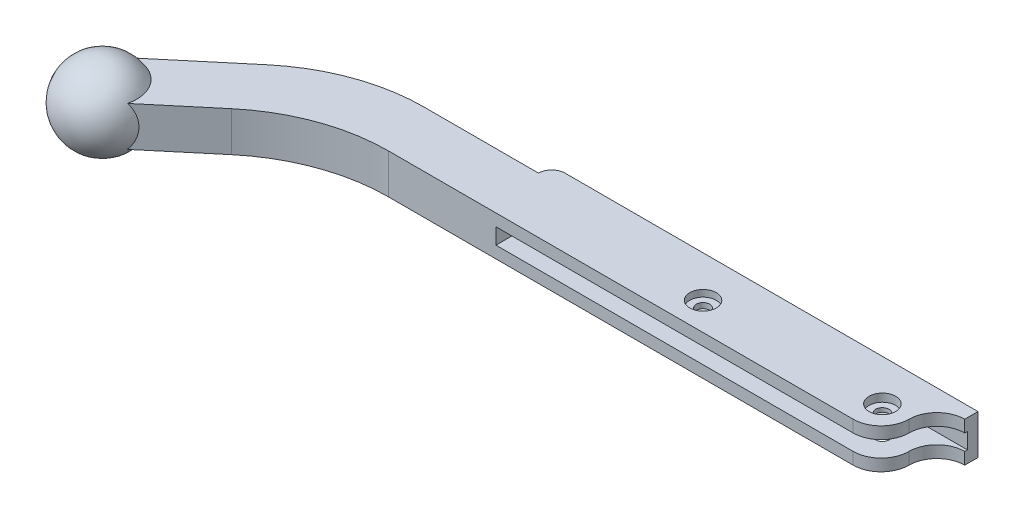
ISO-10303-21;
HEADER;
FILE_DESCRIPTION(('STEP AP214'),'2;1');
FILE_NAME('part.step','',(''),(''),'','','');
FILE_SCHEMA(('AUTOMOTIVE_DESIGN { 1 0 10303 214 1 1 1 1 }'));
ENDSEC;
DATA;
#1=APPLICATION_CONTEXT('core data for automotive mechanical design processes');
#2=APPLICATION_PROTOCOL_DEFINITION('international standard','automotive_design',2000,#1);
#3=PRODUCT_CONTEXT('',#1,'mechanical');
#4=PRODUCT('Part','Part','',(#3));
#5=PRODUCT_RELATED_PRODUCT_CATEGORY('part','',(#4));
#6=PRODUCT_DEFINITION_FORMATION('','',#4);
#7=PRODUCT_DEFINITION_CONTEXT('part definition',#1,'design');
#8=PRODUCT_DEFINITION('design','',#6,#7);
#9=PRODUCT_DEFINITION_SHAPE('','',#8);
#10=(LENGTH_UNIT() NAMED_UNIT(*) SI_UNIT(.MILLI.,.METRE.));
#11=(NAMED_UNIT(*) PLANE_ANGLE_UNIT() SI_UNIT($,.RADIAN.));
#12=(NAMED_UNIT(*) SI_UNIT($,.STERADIAN.) SOLID_ANGLE_UNIT());
#13=UNCERTAINTY_MEASURE_WITH_UNIT(LENGTH_MEASURE(1.E-05),#10,'distance_accuracy_value','');
#14=(GEOMETRIC_REPRESENTATION_CONTEXT(3) GLOBAL_UNCERTAINTY_ASSIGNED_CONTEXT((#13)) GLOBAL_UNIT_ASSIGNED_CONTEXT((#10,
#11,#12)) REPRESENTATION_CONTEXT('',''));
#15=CARTESIAN_POINT('',(0.,0.,0.));
#16=DIRECTION('',(0.,0.,1.));
#17=DIRECTION('',(1.,0.,0.));
#18=AXIS2_PLACEMENT_3D('',#15,#16,#17);
#19=CARTESIAN_POINT('',(52.9707846410685,15.,-18.1552587646077));
#20=DIRECTION('',(-1.,0.,0.));
#21=DIRECTION('',(0.,0.,1.));
#22=AXIS2_PLACEMENT_3D('',#19,#20,#21);
#23=PLANE('',#22);
#24=DIRECTION('',(0.,0.,-1.));
#25=VECTOR('',#24,1.);
#26=CARTESIAN_POINT('',(52.9707846410685,4.5,-18.1552587646077));
#27=LINE('',#26,#25);
#28=CARTESIAN_POINT('',(52.9707846410685,4.5,-13.1552587646077));
#29=VERTEX_POINT('',#28);
#30=CARTESIAN_POINT('',(52.9707846410685,4.5,-14.1552587646077));
#31=VERTEX_POINT('',#30);
#32=EDGE_CURVE('E180',#29,#31,#27,.T.);
#33=ORIENTED_EDGE('',*,*,#32,.F.);
#34=DIRECTION('',(0.,-1.,0.));
#35=VECTOR('',#34,1.);
#36=CARTESIAN_POINT('',(52.9707846410685,15.,-13.1552587646077));
#37=LINE('',#36,#35);
#38=CARTESIAN_POINT('',(52.9707846410685,0.,-13.1552587646077));
#39=VERTEX_POINT('',#38);
#40=EDGE_CURVE('E225',#29,#39,#37,.T.);
#41=ORIENTED_EDGE('',*,*,#40,.T.);
#42=DIRECTION('',(0.,0.,1.));
#43=VECTOR('',#42,1.);
#44=CARTESIAN_POINT('',(52.9707846410685,0.,-18.1552587646077));
#45=LINE('',#44,#43);
#46=CARTESIAN_POINT('',(52.9707846410685,0.,-18.1552587646077));
#47=VERTEX_POINT('',#46);
#48=EDGE_CURVE('E234',#47,#39,#45,.T.);
#49=ORIENTED_EDGE('',*,*,#48,.F.);
#50=DIRECTION('',(0.,-1.,0.));
#51=VECTOR('',#50,1.);
#52=CARTESIAN_POINT('',(52.9707846410685,15.,-18.1552587646077));
#53=LINE('',#52,#51);
#54=CARTESIAN_POINT('',(52.9707846410685,15.,-18.1552587646077));
#55=VERTEX_POINT('',#54);
#56=EDGE_CURVE('E228',#55,#47,#53,.T.);
#57=ORIENTED_EDGE('',*,*,#56,.F.);
#58=DIRECTION('',(0.,0.,1.));
#59=VECTOR('',#58,1.);
#60=CARTESIAN_POINT('',(52.9707846410685,15.,-18.1552587646077));
#61=LINE('',#60,#59);
#62=CARTESIAN_POINT('',(52.9707846410685,15.,-13.1552587646077));
#63=VERTEX_POINT('',#62);
#64=EDGE_CURVE('E239',#55,#63,#61,.T.);
#65=ORIENTED_EDGE('',*,*,#64,.T.);
#66=CARTESIAN_POINT('',(52.9707846410685,10.5,-13.1552587646077));
#67=VERTEX_POINT('',#66);
#68=EDGE_CURVE('E229',#63,#67,#37,.T.);
#69=ORIENTED_EDGE('',*,*,#68,.T.);
#70=DIRECTION('',(0.,0.,1.));
#71=VECTOR('',#70,1.);
#72=CARTESIAN_POINT('',(52.9707846410685,10.5,-18.1552587646077));
#73=LINE('',#72,#71);
#74=CARTESIAN_POINT('',(52.9707846410685,10.5,-14.1552587646077));
#75=VERTEX_POINT('',#74);
#76=EDGE_CURVE('E183',#75,#67,#73,.T.);
#77=ORIENTED_EDGE('',*,*,#76,.F.);
#78=DIRECTION('',(0.,1.,0.));
#79=VECTOR('',#78,1.);
#80=CARTESIAN_POINT('',(52.9707846410685,15.,-14.1552587646077));
#81=LINE('',#80,#79);
#82=EDGE_CURVE('E11',#31,#75,#81,.T.);
#83=ORIENTED_EDGE('',*,*,#82,.F.);
#84=EDGE_LOOP('',(#33,#41,#49,#57,#65,#69,#77,#83));
#85=FACE_BOUND('',#84,.T.);
#86=ADVANCED_FACE('F39',(#85),#23,.F.);
#87=CARTESIAN_POINT('',(-35.0662422389316,-5.,-2.65525876460767));
#88=DIRECTION('',(0.,1.,0.));
#89=DIRECTION('',(0.,0.,1.));
#90=AXIS2_PLACEMENT_3D('',#87,#88,#89);
#91=CYLINDRICAL_SURFACE('',#90,5.);
#92=CARTESIAN_POINT('',(-35.0662422389316,15.,-2.65525876460767));
#93=DIRECTION('',(0.,1.,0.));
#94=DIRECTION('',(0.,0.,1.));
#95=AXIS2_PLACEMENT_3D('',#92,#93,#94);
#96=CIRCLE('',#95,5.);
#97=CARTESIAN_POINT('',(-35.0662422389316,15.,2.34474123539233));
#98=VERTEX_POINT('',#97);
#99=EDGE_CURVE('E252',#98,#98,#96,.T.);
#100=ORIENTED_EDGE('',*,*,#99,.T.);
#101=EDGE_LOOP('',(#100));
#102=FACE_BOUND('',#101,.T.);
#103=CARTESIAN_POINT('',(-35.0662422389316,12.5,-2.65525876460767));
#104=DIRECTION('',(0.,-1.,0.));
#105=DIRECTION('',(0.,0.,-1.));
#106=AXIS2_PLACEMENT_3D('',#103,#104,#105);
#107=CIRCLE('',#106,5.);
#108=CARTESIAN_POINT('',(-35.0662422389316,12.5,-7.65525876460768));
#109=VERTEX_POINT('',#108);
#110=EDGE_CURVE('E296',#109,#109,#107,.F.);
#111=ORIENTED_EDGE('',*,*,#110,.F.);
#112=EDGE_LOOP('',(#111));
#113=FACE_BOUND('',#112,.T.);
#114=ADVANCED_FACE('F404',(#102,#113),#91,.F.);
#115=CARTESIAN_POINT('',(-35.0662422389316,0.,-2.65525876460767));
#116=DIRECTION('',(0.,1.,0.));
#117=DIRECTION('',(0.,0.,1.));
#118=AXIS2_PLACEMENT_3D('',#115,#116,#117);
#119=CIRCLE('',#118,5.);
#120=CARTESIAN_POINT('',(-35.0662422389316,0.,2.34474123539233));
#121=VERTEX_POINT('',#120);
#122=EDGE_CURVE('E255',#121,#121,#119,.T.);
#123=ORIENTED_EDGE('',*,*,#122,.F.);
#124=EDGE_LOOP('',(#123));
#125=FACE_BOUND('',#124,.T.);
#126=CARTESIAN_POINT('',(-35.0662422389316,2.5,-2.65525876460767));
#127=DIRECTION('',(0.,1.,0.));
#128=DIRECTION('',(0.,0.,1.));
#129=AXIS2_PLACEMENT_3D('',#126,#127,#128);
#130=CIRCLE('',#129,5.);
#131=CARTESIAN_POINT('',(-35.0662422389316,2.5,2.34474123539233));
#132=VERTEX_POINT('',#131);
#133=EDGE_CURVE('E290',#132,#132,#130,.F.);
#134=ORIENTED_EDGE('',*,*,#133,.F.);
#135=EDGE_LOOP('',(#134));
#136=FACE_BOUND('',#135,.T.);
#137=ADVANCED_FACE('F410',(#125,#136),#91,.F.);
#138=CARTESIAN_POINT('',(-107.529215358932,15.,7.84474123539233));
#139=DIRECTION('',(0.,0.,-1.));
#140=DIRECTION('',(-1.,0.,0.));
#141=AXIS2_PLACEMENT_3D('',#138,#139,#140);
#142=PLANE('',#141);
#143=DIRECTION('',(1.,0.,0.));
#144=VECTOR('',#143,1.);
#145=CARTESIAN_POINT('',(-107.529215358932,15.,7.84474123539233));
#146=LINE('',#145,#144);
#147=CARTESIAN_POINT('',(-142.961224545963,15.,7.84474123539233));
#148=VERTEX_POINT('',#147);
#149=CARTESIAN_POINT('',(31.9707846410685,15.,7.84474123539233));
#150=VERTEX_POINT('',#149);
#151=EDGE_CURVE('E288',#148,#150,#146,.T.);
#152=ORIENTED_EDGE('',*,*,#151,.F.);
#153=DIRECTION('',(0.,1.,0.));
#154=VECTOR('',#153,1.);
#155=CARTESIAN_POINT('',(-142.961224545963,15.,7.84474123539233));
#156=LINE('',#155,#154);
#157=CARTESIAN_POINT('',(-142.961224545963,0.,7.84474123539233));
#158=VERTEX_POINT('',#157);
#159=EDGE_CURVE('E338',#148,#158,#156,.F.);
#160=ORIENTED_EDGE('',*,*,#159,.T.);
#161=DIRECTION('',(1.,0.,0.));
#162=VECTOR('',#161,1.);
#163=CARTESIAN_POINT('',(-107.529215358932,0.,7.84474123539233));
#164=LINE('',#163,#162);
#165=CARTESIAN_POINT('',(31.9707846410685,0.,7.84474123539233));
#166=VERTEX_POINT('',#165);
#167=EDGE_CURVE('E286',#158,#166,#164,.T.);
#168=ORIENTED_EDGE('',*,*,#167,.T.);
#169=DIRECTION('',(0.,-1.,0.));
#170=VECTOR('',#169,1.);
#171=CARTESIAN_POINT('',(31.9707846410685,15.,7.84474123539233));
#172=LINE('',#171,#170);
#173=CARTESIAN_POINT('',(31.9707846410685,4.5,7.84474123539233));
#174=VERTEX_POINT('',#173);
#175=EDGE_CURVE('E314',#166,#174,#172,.F.);
#176=ORIENTED_EDGE('',*,*,#175,.T.);
#177=DIRECTION('',(1.,0.,0.));
#178=VECTOR('',#177,1.);
#179=CARTESIAN_POINT('',(-102.529215358932,4.5,7.84474123539233));
#180=LINE('',#179,#178);
#181=CARTESIAN_POINT('',(-102.529215358932,4.5,7.84474123539233));
#182=VERTEX_POINT('',#181);
#183=EDGE_CURVE('E282',#182,#174,#180,.T.);
#184=ORIENTED_EDGE('',*,*,#183,.F.);
#185=DIRECTION('',(0.,-1.,0.));
#186=VECTOR('',#185,1.);
#187=CARTESIAN_POINT('',(-102.529215358932,10.5,7.84474123539233));
#188=LINE('',#187,#186);
#189=CARTESIAN_POINT('',(-102.529215358932,10.5,7.84474123539233));
#190=VERTEX_POINT('',#189);
#191=EDGE_CURVE('E170',#190,#182,#188,.T.);
#192=ORIENTED_EDGE('',*,*,#191,.F.);
#193=DIRECTION('',(1.,0.,0.));
#194=VECTOR('',#193,1.);
#195=CARTESIAN_POINT('',(-102.529215358932,10.5,7.84474123539233));
#196=LINE('',#195,#194);
#197=CARTESIAN_POINT('',(31.9707846410685,10.5,7.84474123539233));
#198=VERTEX_POINT('',#197);
#199=EDGE_CURVE('E283',#190,#198,#196,.T.);
#200=ORIENTED_EDGE('',*,*,#199,.T.);
#201=DIRECTION('',(0.,-1.,0.));
#202=VECTOR('',#201,1.);
#203=CARTESIAN_POINT('',(31.9707846410685,15.,7.84474123539233));
#204=LINE('',#203,#202);
#205=EDGE_CURVE('E311',#198,#150,#204,.F.);
#206=ORIENTED_EDGE('',*,*,#205,.T.);
#207=EDGE_LOOP('',(#152,#160,#168,#176,#184,#192,#200,#206));
#208=FACE_BOUND('',#207,.T.);
#209=ADVANCED_FACE('F366',(#208),#142,.F.);
#210=CARTESIAN_POINT('',(0.,15.,0.));
#211=DIRECTION('',(0.,1.,0.));
#212=DIRECTION('',(0.,0.,1.));
#213=AXIS2_PLACEMENT_3D('',#210,#211,#212);
#214=PLANE('',#213);
#215=ORIENTED_EDGE('',*,*,#99,.F.);
#216=EDGE_LOOP('',(#215));
#217=FACE_BOUND('',#216,.T.);
#218=CARTESIAN_POINT('',(32.4707846410684,15.,-2.65525876460767));
#219=DIRECTION('',(0.,1.,0.));
#220=DIRECTION('',(0.,0.,1.));
#221=AXIS2_PLACEMENT_3D('',#218,#219,#220);
#222=CIRCLE('',#221,5.);
#223=CARTESIAN_POINT('',(32.4707846410684,15.,2.34474123539233));
#224=VERTEX_POINT('',#223);
#225=EDGE_CURVE('E272',#224,#224,#222,.T.);
#226=ORIENTED_EDGE('',*,*,#225,.F.);
#227=EDGE_LOOP('',(#226));
#228=FACE_BOUND('',#227,.T.);
#229=DIRECTION('',(-1.,0.,0.));
#230=VECTOR('',#229,1.);
#231=CARTESIAN_POINT('',(-107.529215358932,15.,-13.1552587646077));
#232=LINE('',#231,#230);
#233=CARTESIAN_POINT('',(-107.529215358932,15.,-13.1552587646077));
#234=VERTEX_POINT('',#233);
#235=CARTESIAN_POINT('',(-150.604599465553,15.,-13.1552587646077));
#236=VERTEX_POINT('',#235);
#237=EDGE_CURVE('E204',#234,#236,#232,.T.);
#238=ORIENTED_EDGE('',*,*,#237,.T.);
#239=CARTESIAN_POINT('',(-150.604599465553,15.,54.3447412353923));
#240=DIRECTION('',(0.,1.,0.));
#241=DIRECTION('',(0.,0.,1.));
#242=AXIS2_PLACEMENT_3D('',#239,#240,#241);
#243=CIRCLE('',#242,67.5);
#244=CARTESIAN_POINT('',(-193.992763119394,15.,2.63674132486123));
#245=VERTEX_POINT('',#244);
#246=EDGE_CURVE('E62',#236,#245,#243,.T.);
#247=ORIENTED_EDGE('',*,*,#246,.T.);
#248=DIRECTION('',(-0.766044443118979,0.,0.642787609686538));
#249=VECTOR('',#248,1.);
#250=CARTESIAN_POINT('',(-226.990421749487,15.,30.3250645110862));
#251=LINE('',#250,#249);
#252=CARTESIAN_POINT('',(-221.131308403873,15.,25.4086846637552));
#253=VERTEX_POINT('',#252);
#254=EDGE_CURVE('E216',#245,#253,#251,.T.);
#255=ORIENTED_EDGE('',*,*,#254,.T.);
#256=CARTESIAN_POINT('',(-220.241151847779,15.,38.3685311638355));
#257=DIRECTION('',(0.,-1.,0.));
#258=DIRECTION('',(0.,0.,-1.));
#259=AXIS2_PLACEMENT_3D('',#256,#257,#258);
#260=CIRCLE('',#259,12.9903810567666);
#261=CARTESIAN_POINT('',(-207.632768600456,15.,41.4956179692538));
#262=VERTEX_POINT('',#261);
#263=EDGE_CURVE('E222',#262,#253,#260,.F.);
#264=ORIENTED_EDGE('',*,*,#263,.F.);
#265=DIRECTION('',(0.766044443118977,0.,-0.64278760968654));
#266=VECTOR('',#265,1.);
#267=CARTESIAN_POINT('',(-167.529215358932,15.,7.84474123539233));
#268=LINE('',#267,#266);
#269=CARTESIAN_POINT('',(-186.349388199804,15.,23.6367413248614));
#270=VERTEX_POINT('',#269);
#271=EDGE_CURVE('E209',#262,#270,#268,.T.);
#272=ORIENTED_EDGE('',*,*,#271,.T.);
#273=CARTESIAN_POINT('',(-142.961224545963,15.,75.3447412353923));
#274=DIRECTION('',(0.,1.,0.));
#275=DIRECTION('',(0.,0.,1.));
#276=AXIS2_PLACEMENT_3D('',#273,#274,#275);
#277=CIRCLE('',#276,67.5);
#278=EDGE_CURVE('E347',#270,#148,#277,.F.);
#279=ORIENTED_EDGE('',*,*,#278,.T.);
#280=ORIENTED_EDGE('',*,*,#151,.T.);
#281=CARTESIAN_POINT('',(31.9707846410685,15.,-2.65525876460767));
#282=DIRECTION('',(0.,1.,0.));
#283=DIRECTION('',(0.,0.,1.));
#284=AXIS2_PLACEMENT_3D('',#281,#282,#283);
#285=CIRCLE('',#284,10.5);
#286=CARTESIAN_POINT('',(42.4707846410685,15.,-2.65525876460768));
#287=VERTEX_POINT('',#286);
#288=EDGE_CURVE('E321',#150,#287,#285,.T.);
#289=ORIENTED_EDGE('',*,*,#288,.T.);
#290=CARTESIAN_POINT('',(52.9707846410685,15.,-2.65525876460767));
#291=DIRECTION('',(0.,1.,0.));
#292=DIRECTION('',(0.,0.,1.));
#293=AXIS2_PLACEMENT_3D('',#290,#291,#292);
#294=CIRCLE('',#293,10.5);
#295=EDGE_CURVE('E329',#287,#63,#294,.F.);
#296=ORIENTED_EDGE('',*,*,#295,.T.);
#297=ORIENTED_EDGE('',*,*,#64,.F.);
#298=DIRECTION('',(1.,0.,0.));
#299=VECTOR('',#298,1.);
#300=CARTESIAN_POINT('',(-107.529215358932,15.,-18.1552587646077));
#301=LINE('',#300,#299);
#302=CARTESIAN_POINT('',(-102.529215358932,15.,-18.1552587646077));
#303=VERTEX_POINT('',#302);
#304=EDGE_CURVE('E226',#303,#55,#301,.T.);
#305=ORIENTED_EDGE('',*,*,#304,.F.);
#306=CARTESIAN_POINT('',(-102.529215358932,15.,-13.1552587646077));
#307=DIRECTION('',(0.,1.,0.));
#308=DIRECTION('',(0.,0.,1.));
#309=AXIS2_PLACEMENT_3D('',#306,#307,#308);
#310=CIRCLE('',#309,5.);
#311=EDGE_CURVE('E304',#303,#234,#310,.T.);
#312=ORIENTED_EDGE('',*,*,#311,.T.);
#313=EDGE_LOOP('',(#238,#247,#255,#264,#272,#279,#280,#289,#296,#297,#305,#312));
#314=FACE_BOUND('',#313,.T.);
#315=ADVANCED_FACE('F363',(#217,#228,#314),#214,.T.);
#316=CARTESIAN_POINT('',(0.,0.,0.));
#317=DIRECTION('',(0.,1.,0.));
#318=DIRECTION('',(0.,0.,1.));
#319=AXIS2_PLACEMENT_3D('',#316,#317,#318);
#320=PLANE('',#319);
#321=ORIENTED_EDGE('',*,*,#122,.T.);
#322=EDGE_LOOP('',(#321));
#323=FACE_BOUND('',#322,.T.);
#324=CARTESIAN_POINT('',(32.4707846410684,0.,-2.65525876460767));
#325=DIRECTION('',(0.,-1.,0.));
#326=DIRECTION('',(0.,0.,-1.));
#327=AXIS2_PLACEMENT_3D('',#324,#325,#326);
#328=CIRCLE('',#327,5.);
#329=CARTESIAN_POINT('',(32.4707846410684,0.,-7.65525876460768));
#330=VERTEX_POINT('',#329);
#331=EDGE_CURVE('E268',#330,#330,#328,.T.);
#332=ORIENTED_EDGE('',*,*,#331,.F.);
#333=EDGE_LOOP('',(#332));
#334=FACE_BOUND('',#333,.T.);
#335=DIRECTION('',(-0.766044443118979,0.,0.642787609686538));
#336=VECTOR('',#335,1.);
#337=CARTESIAN_POINT('',(-226.990421749487,0.,30.3250645110862));
#338=LINE('',#337,#336);
#339=CARTESIAN_POINT('',(-193.992763119394,0.,2.63674132486123));
#340=VERTEX_POINT('',#339);
#341=CARTESIAN_POINT('',(-221.131308403873,0.,25.4086846637552));
#342=VERTEX_POINT('',#341);
#343=EDGE_CURVE('E208',#340,#342,#338,.T.);
#344=ORIENTED_EDGE('',*,*,#343,.F.);
#345=CARTESIAN_POINT('',(-150.604599465553,0.,54.3447412353923));
#346=DIRECTION('',(0.,1.,0.));
#347=DIRECTION('',(0.,0.,1.));
#348=AXIS2_PLACEMENT_3D('',#345,#346,#347);
#349=CIRCLE('',#348,67.5);
#350=CARTESIAN_POINT('',(-150.604599465553,0.,-13.1552587646077));
#351=VERTEX_POINT('',#350);
#352=EDGE_CURVE('E345',#340,#351,#349,.F.);
#353=ORIENTED_EDGE('',*,*,#352,.T.);
#354=DIRECTION('',(-1.,0.,0.));
#355=VECTOR('',#354,1.);
#356=CARTESIAN_POINT('',(-107.529215358932,0.,-13.1552587646077));
#357=LINE('',#356,#355);
#358=CARTESIAN_POINT('',(-107.529215358932,0.,-13.1552587646077));
#359=VERTEX_POINT('',#358);
#360=EDGE_CURVE('E205',#359,#351,#357,.T.);
#361=ORIENTED_EDGE('',*,*,#360,.F.);
#362=CARTESIAN_POINT('',(-102.529215358932,0.,-13.1552587646077));
#363=DIRECTION('',(0.,1.,0.));
#364=DIRECTION('',(0.,0.,1.));
#365=AXIS2_PLACEMENT_3D('',#362,#363,#364);
#366=CIRCLE('',#365,5.);
#367=CARTESIAN_POINT('',(-102.529215358932,0.,-18.1552587646077));
#368=VERTEX_POINT('',#367);
#369=EDGE_CURVE('E306',#359,#368,#366,.F.);
#370=ORIENTED_EDGE('',*,*,#369,.T.);
#371=DIRECTION('',(-1.,0.,0.));
#372=VECTOR('',#371,1.);
#373=CARTESIAN_POINT('',(-107.529215358932,0.,-18.1552587646077));
#374=LINE('',#373,#372);
#375=EDGE_CURVE('E231',#47,#368,#374,.T.);
#376=ORIENTED_EDGE('',*,*,#375,.F.);
#377=ORIENTED_EDGE('',*,*,#48,.T.);
#378=CARTESIAN_POINT('',(52.9707846410685,0.,-2.65525876460767));
#379=DIRECTION('',(0.,1.,0.));
#380=DIRECTION('',(0.,0.,1.));
#381=AXIS2_PLACEMENT_3D('',#378,#379,#380);
#382=CIRCLE('',#381,10.5);
#383=CARTESIAN_POINT('',(42.4707846410685,0.,-2.65525876460768));
#384=VERTEX_POINT('',#383);
#385=EDGE_CURVE('E323',#39,#384,#382,.T.);
#386=ORIENTED_EDGE('',*,*,#385,.T.);
#387=CARTESIAN_POINT('',(31.9707846410685,0.,-2.65525876460767));
#388=DIRECTION('',(0.,1.,0.));
#389=DIRECTION('',(0.,0.,1.));
#390=AXIS2_PLACEMENT_3D('',#387,#388,#389);
#391=CIRCLE('',#390,10.5);
#392=EDGE_CURVE('E308',#384,#166,#391,.F.);
#393=ORIENTED_EDGE('',*,*,#392,.T.);
#394=ORIENTED_EDGE('',*,*,#167,.F.);
#395=CARTESIAN_POINT('',(-142.961224545963,0.,75.3447412353923));
#396=DIRECTION('',(0.,1.,0.));
#397=DIRECTION('',(0.,0.,1.));
#398=AXIS2_PLACEMENT_3D('',#395,#396,#397);
#399=CIRCLE('',#398,67.5);
#400=CARTESIAN_POINT('',(-186.349388199804,0.,23.6367413248614));
#401=VERTEX_POINT('',#400);
#402=EDGE_CURVE('E47',#158,#401,#399,.T.);
#403=ORIENTED_EDGE('',*,*,#402,.T.);
#404=DIRECTION('',(0.766044443118977,0.,-0.64278760968654));
#405=VECTOR('',#404,1.);
#406=CARTESIAN_POINT('',(-167.529215358932,0.,7.84474123539233));
#407=LINE('',#406,#405);
#408=CARTESIAN_POINT('',(-207.632768600456,0.,41.4956179692538));
#409=VERTEX_POINT('',#408);
#410=EDGE_CURVE('E211',#409,#401,#407,.T.);
#411=ORIENTED_EDGE('',*,*,#410,.F.);
#412=CARTESIAN_POINT('',(-220.241151847779,0.,38.3685311638355));
#413=DIRECTION('',(0.,-1.,0.));
#414=DIRECTION('',(0.,0.,-1.));
#415=AXIS2_PLACEMENT_3D('',#412,#413,#414);
#416=CIRCLE('',#415,12.9903810567666);
#417=EDGE_CURVE('E201',#409,#342,#416,.F.);
#418=ORIENTED_EDGE('',*,*,#417,.T.);
#419=EDGE_LOOP('',(#344,#353,#361,#370,#376,#377,#386,#393,#394,#403,#411,#418));
#420=FACE_BOUND('',#419,.T.);
#421=ADVANCED_FACE('F352',(#323,#334,#420),#320,.F.);
#422=CARTESIAN_POINT('',(-102.529215358932,10.5,7.84474123539233));
#423=DIRECTION('',(0.,1.,0.));
#424=DIRECTION('',(0.,0.,1.));
#425=AXIS2_PLACEMENT_3D('',#422,#423,#424);
#426=PLANE('',#425);
#427=CARTESIAN_POINT('',(-35.0662422389316,10.5,-2.65525876460767));
#428=DIRECTION('',(0.,1.,0.));
#429=DIRECTION('',(0.,0.,1.));
#430=AXIS2_PLACEMENT_3D('',#427,#428,#429);
#431=CIRCLE('',#430,2.5);
#432=CARTESIAN_POINT('',(-35.0662422389316,10.5,-0.155258764607672));
#433=VERTEX_POINT('',#432);
#434=EDGE_CURVE('E249',#433,#433,#431,.T.);
#435=ORIENTED_EDGE('',*,*,#434,.T.);
#436=EDGE_LOOP('',(#435));
#437=FACE_BOUND('',#436,.T.);
#438=CARTESIAN_POINT('',(32.4707846410684,10.5,-2.65525876460767));
#439=DIRECTION('',(0.,1.,0.));
#440=DIRECTION('',(0.,0.,1.));
#441=AXIS2_PLACEMENT_3D('',#438,#439,#440);
#442=CIRCLE('',#441,2.5);
#443=CARTESIAN_POINT('',(32.4707846410684,10.5,-0.155258764607676));
#444=VERTEX_POINT('',#443);
#445=EDGE_CURVE('E265',#444,#444,#442,.T.);
#446=ORIENTED_EDGE('',*,*,#445,.T.);
#447=EDGE_LOOP('',(#446));
#448=FACE_BOUND('',#447,.T.);
#449=DIRECTION('',(0.,0.,1.));
#450=VECTOR('',#449,1.);
#451=CARTESIAN_POINT('',(-102.529215358932,10.5,7.84474123539233));
#452=LINE('',#451,#450);
#453=CARTESIAN_POINT('',(-102.529215358932,10.5,-14.1552587646077));
#454=VERTEX_POINT('',#453);
#455=EDGE_CURVE('E174',#454,#190,#452,.T.);
#456=ORIENTED_EDGE('',*,*,#455,.F.);
#457=DIRECTION('',(-1.,0.,0.));
#458=VECTOR('',#457,1.);
#459=CARTESIAN_POINT('',(97.4707846410685,10.5,-14.1552587646077));
#460=LINE('',#459,#458);
#461=EDGE_CURVE('E184',#75,#454,#460,.T.);
#462=ORIENTED_EDGE('',*,*,#461,.F.);
#463=ORIENTED_EDGE('',*,*,#76,.T.);
#464=CARTESIAN_POINT('',(52.9707846410685,10.5,-2.65525876460767));
#465=DIRECTION('',(0.,1.,0.));
#466=DIRECTION('',(0.,0.,1.));
#467=AXIS2_PLACEMENT_3D('',#464,#465,#466);
#468=CIRCLE('',#467,10.5);
#469=CARTESIAN_POINT('',(42.4707846410685,10.5,-2.65525876460767));
#470=VERTEX_POINT('',#469);
#471=EDGE_CURVE('E327',#67,#470,#468,.T.);
#472=ORIENTED_EDGE('',*,*,#471,.T.);
#473=CARTESIAN_POINT('',(31.9707846410685,10.5,-2.65525876460767));
#474=DIRECTION('',(0.,1.,0.));
#475=DIRECTION('',(0.,0.,1.));
#476=AXIS2_PLACEMENT_3D('',#473,#474,#475);
#477=CIRCLE('',#476,10.5);
#478=EDGE_CURVE('E319',#470,#198,#477,.F.);
#479=ORIENTED_EDGE('',*,*,#478,.T.);
#480=ORIENTED_EDGE('',*,*,#199,.F.);
#481=EDGE_LOOP('',(#456,#462,#463,#472,#479,#480));
#482=FACE_BOUND('',#481,.T.);
#483=ADVANCED_FACE('F454',(#437,#448,#482),#426,.F.);
#484=CARTESIAN_POINT('',(-102.529215358932,4.5,7.84474123539233));
#485=DIRECTION('',(0.,-1.,0.));
#486=DIRECTION('',(0.,0.,-1.));
#487=AXIS2_PLACEMENT_3D('',#484,#485,#486);
#488=PLANE('',#487);
#489=CARTESIAN_POINT('',(-35.0662422389316,4.5,-2.65525876460767));
#490=DIRECTION('',(0.,-1.,0.));
#491=DIRECTION('',(0.,0.,-1.));
#492=AXIS2_PLACEMENT_3D('',#489,#490,#491);
#493=CIRCLE('',#492,2.5);
#494=CARTESIAN_POINT('',(-35.0662422389316,4.5,-5.15525876460768));
#495=VERTEX_POINT('',#494);
#496=EDGE_CURVE('E246',#495,#495,#493,.T.);
#497=ORIENTED_EDGE('',*,*,#496,.T.);
#498=EDGE_LOOP('',(#497));
#499=FACE_BOUND('',#498,.T.);
#500=CARTESIAN_POINT('',(32.4707846410684,4.5,-2.65525876460767));
#501=DIRECTION('',(0.,-1.,0.));
#502=DIRECTION('',(0.,0.,-1.));
#503=AXIS2_PLACEMENT_3D('',#500,#501,#502);
#504=CIRCLE('',#503,2.5);
#505=CARTESIAN_POINT('',(32.4707846410684,4.5,-5.15525876460767));
#506=VERTEX_POINT('',#505);
#507=EDGE_CURVE('E262',#506,#506,#504,.T.);
#508=ORIENTED_EDGE('',*,*,#507,.T.);
#509=EDGE_LOOP('',(#508));
#510=FACE_BOUND('',#509,.T.);
#511=ORIENTED_EDGE('',*,*,#183,.T.);
#512=CARTESIAN_POINT('',(31.9707846410685,4.5,-2.65525876460767));
#513=DIRECTION('',(0.,-1.,0.));
#514=DIRECTION('',(0.,0.,-1.));
#515=AXIS2_PLACEMENT_3D('',#512,#513,#514);
#516=CIRCLE('',#515,10.5);
#517=CARTESIAN_POINT('',(42.4707846410685,4.5,-2.65525876460767));
#518=VERTEX_POINT('',#517);
#519=EDGE_CURVE('E317',#174,#518,#516,.F.);
#520=ORIENTED_EDGE('',*,*,#519,.T.);
#521=CARTESIAN_POINT('',(52.9707846410685,4.5,-2.65525876460767));
#522=DIRECTION('',(0.,-1.,0.));
#523=DIRECTION('',(0.,0.,-1.));
#524=AXIS2_PLACEMENT_3D('',#521,#522,#523);
#525=CIRCLE('',#524,10.5);
#526=EDGE_CURVE('E325',#518,#29,#525,.T.);
#527=ORIENTED_EDGE('',*,*,#526,.T.);
#528=ORIENTED_EDGE('',*,*,#32,.T.);
#529=DIRECTION('',(-1.,0.,0.));
#530=VECTOR('',#529,1.);
#531=CARTESIAN_POINT('',(97.4707846410685,4.5,-14.1552587646077));
#532=LINE('',#531,#530);
#533=CARTESIAN_POINT('',(-102.529215358932,4.5,-14.1552587646077));
#534=VERTEX_POINT('',#533);
#535=EDGE_CURVE('E177',#31,#534,#532,.T.);
#536=ORIENTED_EDGE('',*,*,#535,.T.);
#537=DIRECTION('',(0.,0.,-1.));
#538=VECTOR('',#537,1.);
#539=CARTESIAN_POINT('',(-102.529215358932,4.5,7.84474123539233));
#540=LINE('',#539,#538);
#541=EDGE_CURVE('E163',#182,#534,#540,.T.);
#542=ORIENTED_EDGE('',*,*,#541,.F.);
#543=EDGE_LOOP('',(#511,#520,#527,#528,#536,#542));
#544=FACE_BOUND('',#543,.T.);
#545=ADVANCED_FACE('F178',(#499,#510,#544),#488,.F.);
#546=CARTESIAN_POINT('',(-102.529215358932,0.,0.));
#547=DIRECTION('',(1.,0.,0.));
#548=DIRECTION('',(0.,0.,-1.));
#549=AXIS2_PLACEMENT_3D('',#546,#547,#548);
#550=PLANE('',#549);
#551=ORIENTED_EDGE('',*,*,#191,.T.);
#552=ORIENTED_EDGE('',*,*,#541,.T.);
#553=DIRECTION('',(0.,1.,0.));
#554=VECTOR('',#553,1.);
#555=CARTESIAN_POINT('',(-102.529215358932,10.5,-14.1552587646077));
#556=LINE('',#555,#554);
#557=EDGE_CURVE('E168',#534,#454,#556,.T.);
#558=ORIENTED_EDGE('',*,*,#557,.T.);
#559=ORIENTED_EDGE('',*,*,#455,.T.);
#560=EDGE_LOOP('',(#551,#552,#558,#559));
#561=FACE_BOUND('',#560,.T.);
#562=ADVANCED_FACE('F165',(#561),#550,.T.);
#563=CARTESIAN_POINT('',(32.4707846410684,12.,-2.65525876460767));
#564=DIRECTION('',(0.,1.,0.));
#565=DIRECTION('',(0.,0.,1.));
#566=AXIS2_PLACEMENT_3D('',#563,#564,#565);
#567=CYLINDRICAL_SURFACE('',#566,5.);
#568=CARTESIAN_POINT('',(32.4707846410684,12.,-2.65525876460767));
#569=DIRECTION('',(0.,1.,0.));
#570=DIRECTION('',(0.,0.,1.));
#571=AXIS2_PLACEMENT_3D('',#568,#569,#570);
#572=CIRCLE('',#571,5.);
#573=CARTESIAN_POINT('',(32.4707846410684,12.,2.34474123539233));
#574=VERTEX_POINT('',#573);
#575=EDGE_CURVE('E275',#574,#574,#572,.T.);
#576=ORIENTED_EDGE('',*,*,#575,.F.);
#577=EDGE_LOOP('',(#576));
#578=FACE_BOUND('',#577,.T.);
#579=ORIENTED_EDGE('',*,*,#225,.T.);
#580=EDGE_LOOP('',(#579));
#581=FACE_BOUND('',#580,.T.);
#582=ADVANCED_FACE('F447',(#578,#581),#567,.F.);
#583=CARTESIAN_POINT('',(32.4707846410684,12.,-2.65525876460767));
#584=DIRECTION('',(0.,1.,0.));
#585=DIRECTION('',(0.,0.,1.));
#586=AXIS2_PLACEMENT_3D('',#583,#584,#585);
#587=PLANE('',#586);
#588=CARTESIAN_POINT('',(32.4707846410684,12.,-2.65525876460767));
#589=DIRECTION('',(0.,1.,0.));
#590=DIRECTION('',(0.,0.,1.));
#591=AXIS2_PLACEMENT_3D('',#588,#589,#590);
#592=CIRCLE('',#591,2.5);
#593=CARTESIAN_POINT('',(32.4707846410684,12.,-0.155258764607676));
#594=VERTEX_POINT('',#593);
#595=EDGE_CURVE('E261',#594,#594,#592,.T.);
#596=ORIENTED_EDGE('',*,*,#595,.F.);
#597=EDGE_LOOP('',(#596));
#598=FACE_BOUND('',#597,.T.);
#599=ORIENTED_EDGE('',*,*,#575,.T.);
#600=EDGE_LOOP('',(#599));
#601=FACE_BOUND('',#600,.T.);
#602=ADVANCED_FACE('F443',(#598,#601),#587,.T.);
#603=CARTESIAN_POINT('',(32.4707846410684,3.,-2.65525876460767));
#604=DIRECTION('',(0.,-1.,0.));
#605=DIRECTION('',(0.,0.,-1.));
#606=AXIS2_PLACEMENT_3D('',#603,#604,#605);
#607=CYLINDRICAL_SURFACE('',#606,5.);
#608=CARTESIAN_POINT('',(32.4707846410684,3.,-2.65525876460767));
#609=DIRECTION('',(0.,-1.,0.));
#610=DIRECTION('',(0.,0.,-1.));
#611=AXIS2_PLACEMENT_3D('',#608,#609,#610);
#612=CIRCLE('',#611,5.);
#613=CARTESIAN_POINT('',(32.4707846410684,3.,-7.65525876460768));
#614=VERTEX_POINT('',#613);
#615=EDGE_CURVE('E269',#614,#614,#612,.T.);
#616=ORIENTED_EDGE('',*,*,#615,.F.);
#617=EDGE_LOOP('',(#616));
#618=FACE_BOUND('',#617,.T.);
#619=ORIENTED_EDGE('',*,*,#331,.T.);
#620=EDGE_LOOP('',(#619));
#621=FACE_BOUND('',#620,.T.);
#622=ADVANCED_FACE('F439',(#618,#621),#607,.F.);
#623=CARTESIAN_POINT('',(32.4707846410684,3.,-2.65525876460767));
#624=DIRECTION('',(0.,-1.,0.));
#625=DIRECTION('',(0.,0.,-1.));
#626=AXIS2_PLACEMENT_3D('',#623,#624,#625);
#627=PLANE('',#626);
#628=CARTESIAN_POINT('',(32.4707846410684,3.,-2.65525876460767));
#629=DIRECTION('',(0.,-1.,0.));
#630=DIRECTION('',(0.,0.,-1.));
#631=AXIS2_PLACEMENT_3D('',#628,#629,#630);
#632=CIRCLE('',#631,2.5);
#633=CARTESIAN_POINT('',(32.4707846410684,3.,-5.15525876460767));
#634=VERTEX_POINT('',#633);
#635=EDGE_CURVE('E258',#634,#634,#632,.T.);
#636=ORIENTED_EDGE('',*,*,#635,.F.);
#637=EDGE_LOOP('',(#636));
#638=FACE_BOUND('',#637,.T.);
#639=ORIENTED_EDGE('',*,*,#615,.T.);
#640=EDGE_LOOP('',(#639));
#641=FACE_BOUND('',#640,.T.);
#642=ADVANCED_FACE('F435',(#638,#641),#627,.T.);
#643=CARTESIAN_POINT('',(32.4707846410684,23.,-2.65525876460767));
#644=DIRECTION('',(0.,-1.,0.));
#645=DIRECTION('',(0.,0.,-1.));
#646=AXIS2_PLACEMENT_3D('',#643,#644,#645);
#647=CYLINDRICAL_SURFACE('',#646,2.5);
#648=ORIENTED_EDGE('',*,*,#595,.T.);
#649=EDGE_LOOP('',(#648));
#650=FACE_BOUND('',#649,.T.);
#651=ORIENTED_EDGE('',*,*,#445,.F.);
#652=EDGE_LOOP('',(#651));
#653=FACE_BOUND('',#652,.T.);
#654=ADVANCED_FACE('F432',(#650,#653),#647,.F.);
#655=ORIENTED_EDGE('',*,*,#635,.T.);
#656=EDGE_LOOP('',(#655));
#657=FACE_BOUND('',#656,.T.);
#658=ORIENTED_EDGE('',*,*,#507,.F.);
#659=EDGE_LOOP('',(#658));
#660=FACE_BOUND('',#659,.T.);
#661=ADVANCED_FACE('F427',(#657,#660),#647,.F.);
#662=CARTESIAN_POINT('',(-35.0662422389316,2.5,-2.65525876460767));
#663=DIRECTION('',(0.,1.,0.));
#664=DIRECTION('',(0.,0.,1.));
#665=AXIS2_PLACEMENT_3D('',#662,#663,#664);
#666=PLANE('',#665);
#667=CARTESIAN_POINT('',(-35.0662422389316,2.5,-2.65525876460767));
#668=DIRECTION('',(0.,1.,0.));
#669=DIRECTION('',(0.,0.,1.));
#670=AXIS2_PLACEMENT_3D('',#667,#668,#669);
#671=CIRCLE('',#670,2.5);
#672=CARTESIAN_POINT('',(-35.0662422389316,2.5,-0.155258764607672));
#673=VERTEX_POINT('',#672);
#674=EDGE_CURVE('E245',#673,#673,#671,.T.);
#675=ORIENTED_EDGE('',*,*,#674,.T.);
#676=EDGE_LOOP('',(#675));
#677=FACE_BOUND('',#676,.T.);
#678=ORIENTED_EDGE('',*,*,#133,.T.);
#679=EDGE_LOOP('',(#678));
#680=FACE_BOUND('',#679,.T.);
#681=ADVANCED_FACE('F424',(#677,#680),#666,.F.);
#682=CARTESIAN_POINT('',(-35.0662422389316,12.5,-2.65525876460767));
#683=DIRECTION('',(0.,-1.,0.));
#684=DIRECTION('',(0.,0.,-1.));
#685=AXIS2_PLACEMENT_3D('',#682,#683,#684);
#686=PLANE('',#685);
#687=CARTESIAN_POINT('',(-35.0662422389316,12.5,-2.65525876460767));
#688=DIRECTION('',(0.,1.,0.));
#689=DIRECTION('',(0.,0.,1.));
#690=AXIS2_PLACEMENT_3D('',#687,#688,#689);
#691=CIRCLE('',#690,2.5);
#692=CARTESIAN_POINT('',(-35.0662422389316,12.5,-0.155258764607672));
#693=VERTEX_POINT('',#692);
#694=EDGE_CURVE('E242',#693,#693,#691,.T.);
#695=ORIENTED_EDGE('',*,*,#694,.F.);
#696=EDGE_LOOP('',(#695));
#697=FACE_BOUND('',#696,.T.);
#698=ORIENTED_EDGE('',*,*,#110,.T.);
#699=EDGE_LOOP('',(#698));
#700=FACE_BOUND('',#699,.T.);
#701=ADVANCED_FACE('F421',(#697,#700),#686,.F.);
#702=CARTESIAN_POINT('',(-35.0662422389316,-7.5,-2.65525876460767));
#703=DIRECTION('',(0.,1.,0.));
#704=DIRECTION('',(0.,0.,1.));
#705=AXIS2_PLACEMENT_3D('',#702,#703,#704);
#706=CYLINDRICAL_SURFACE('',#705,2.5);
#707=ORIENTED_EDGE('',*,*,#674,.F.);
#708=EDGE_LOOP('',(#707));
#709=FACE_BOUND('',#708,.T.);
#710=ORIENTED_EDGE('',*,*,#496,.F.);
#711=EDGE_LOOP('',(#710));
#712=FACE_BOUND('',#711,.T.);
#713=ADVANCED_FACE('F419',(#709,#712),#706,.F.);
#714=ORIENTED_EDGE('',*,*,#694,.T.);
#715=EDGE_LOOP('',(#714));
#716=FACE_BOUND('',#715,.T.);
#717=ORIENTED_EDGE('',*,*,#434,.F.);
#718=EDGE_LOOP('',(#717));
#719=FACE_BOUND('',#718,.T.);
#720=ADVANCED_FACE('F416',(#716,#719),#706,.F.);
#721=CARTESIAN_POINT('',(0.,0.,-18.1552587646077));
#722=DIRECTION('',(0.,0.,1.));
#723=DIRECTION('',(1.,0.,0.));
#724=AXIS2_PLACEMENT_3D('',#721,#722,#723);
#725=PLANE('',#724);
#726=ORIENTED_EDGE('',*,*,#375,.T.);
#727=DIRECTION('',(0.,1.,0.));
#728=VECTOR('',#727,1.);
#729=CARTESIAN_POINT('',(-102.529215358932,0.,-18.1552587646077));
#730=LINE('',#729,#728);
#731=EDGE_CURVE('E299',#368,#303,#730,.T.);
#732=ORIENTED_EDGE('',*,*,#731,.T.);
#733=ORIENTED_EDGE('',*,*,#304,.T.);
#734=ORIENTED_EDGE('',*,*,#56,.T.);
#735=EDGE_LOOP('',(#726,#732,#733,#734));
#736=FACE_BOUND('',#735,.T.);
#737=ADVANCED_FACE('F385',(#736),#725,.F.);
#738=CARTESIAN_POINT('',(-167.529215358932,0.,7.84474123539233));
#739=DIRECTION('',(0.64278760968654,0.,0.766044443118977));
#740=DIRECTION('',(0.766044443118977,0.,-0.64278760968654));
#741=AXIS2_PLACEMENT_3D('',#738,#739,#740);
#742=PLANE('',#741);
#743=ORIENTED_EDGE('',*,*,#410,.T.);
#744=DIRECTION('',(0.,1.,0.));
#745=VECTOR('',#744,1.);
#746=CARTESIAN_POINT('',(-186.349388199804,0.,23.6367413248614));
#747=LINE('',#746,#745);
#748=EDGE_CURVE('E331',#401,#270,#747,.T.);
#749=ORIENTED_EDGE('',*,*,#748,.T.);
#750=ORIENTED_EDGE('',*,*,#271,.F.);
#751=CARTESIAN_POINT('',(-213.49188194607,7.5,46.4119978165848));
#752=DIRECTION('',(0.64278760968654,0.,0.766044443118977));
#753=DIRECTION('',(0.766044443118977,0.,-0.64278760968654));
#754=AXIS2_PLACEMENT_3D('',#751,#752,#753);
#755=CIRCLE('',#754,10.7121426428143);
#756=EDGE_CURVE('E198',#262,#409,#755,.F.);
#757=ORIENTED_EDGE('',*,*,#756,.T.);
#758=EDGE_LOOP('',(#743,#749,#750,#757));
#759=FACE_BOUND('',#758,.T.);
#760=ADVANCED_FACE('F358',(#759),#742,.T.);
#761=CARTESIAN_POINT('',(-226.990421749487,0.,30.3250645110862));
#762=DIRECTION('',(-0.642787609686538,0.,-0.766044443118979));
#763=DIRECTION('',(-0.76604444311898,0.,0.642787609686538));
#764=AXIS2_PLACEMENT_3D('',#761,#762,#763);
#765=PLANE('',#764);
#766=ORIENTED_EDGE('',*,*,#254,.F.);
#767=DIRECTION('',(0.,1.,0.));
#768=VECTOR('',#767,1.);
#769=CARTESIAN_POINT('',(-193.992763119394,0.,2.63674132486124));
#770=LINE('',#769,#768);
#771=EDGE_CURVE('E54',#245,#340,#770,.F.);
#772=ORIENTED_EDGE('',*,*,#771,.T.);
#773=ORIENTED_EDGE('',*,*,#343,.T.);
#774=CARTESIAN_POINT('',(-226.990421749488,7.5,30.3250645110863));
#775=DIRECTION('',(-0.642787609686538,0.,-0.766044443118979));
#776=DIRECTION('',(-0.76604444311898,0.,0.642787609686538));
#777=AXIS2_PLACEMENT_3D('',#774,#775,#776);
#778=CIRCLE('',#777,10.7121426428143);
#779=EDGE_CURVE('E195',#342,#253,#778,.F.);
#780=ORIENTED_EDGE('',*,*,#779,.T.);
#781=EDGE_LOOP('',(#766,#772,#773,#780));
#782=FACE_BOUND('',#781,.T.);
#783=ADVANCED_FACE('F567',(#782),#765,.T.);
#784=CARTESIAN_POINT('',(-107.529215358932,0.,-13.1552587646077));
#785=DIRECTION('',(0.,0.,-1.));
#786=DIRECTION('',(-1.,0.,0.));
#787=AXIS2_PLACEMENT_3D('',#784,#785,#786);
#788=PLANE('',#787);
#789=ORIENTED_EDGE('',*,*,#360,.T.);
#790=DIRECTION('',(0.,1.,0.));
#791=VECTOR('',#790,1.);
#792=CARTESIAN_POINT('',(-150.604599465553,0.,-13.1552587646077));
#793=LINE('',#792,#791);
#794=EDGE_CURVE('E340',#351,#236,#793,.T.);
#795=ORIENTED_EDGE('',*,*,#794,.T.);
#796=ORIENTED_EDGE('',*,*,#237,.F.);
#797=DIRECTION('',(0.,1.,0.));
#798=VECTOR('',#797,1.);
#799=CARTESIAN_POINT('',(-107.529215358932,0.,-13.1552587646077));
#800=LINE('',#799,#798);
#801=EDGE_CURVE('E214',#359,#234,#800,.T.);
#802=ORIENTED_EDGE('',*,*,#801,.F.);
#803=EDGE_LOOP('',(#789,#795,#796,#802));
#804=FACE_BOUND('',#803,.T.);
#805=ADVANCED_FACE('F393',(#804),#788,.T.);
#806=CARTESIAN_POINT('',(-220.241151847779,7.5,38.3685311638355));
#807=DIRECTION('',(0.,1.,0.));
#808=DIRECTION('',(0.64278760968654,0.,0.766044443118977));
#809=AXIS2_PLACEMENT_3D('',#806,#807,#808);
#810=SPHERICAL_SURFACE('',#809,15.);
#811=ORIENTED_EDGE('',*,*,#417,.F.);
#812=ORIENTED_EDGE('',*,*,#756,.F.);
#813=ORIENTED_EDGE('',*,*,#263,.T.);
#814=ORIENTED_EDGE('',*,*,#779,.F.);
#815=EDGE_LOOP('',(#811,#812,#813,#814));
#816=FACE_BOUND('',#815,.T.);
#817=ADVANCED_FACE('F471',(#816),#810,.T.);
#818=CARTESIAN_POINT('',(-102.529215358932,0.,-13.1552587646077));
#819=DIRECTION('',(0.,1.,0.));
#820=DIRECTION('',(0.,0.,1.));
#821=AXIS2_PLACEMENT_3D('',#818,#819,#820);
#822=CYLINDRICAL_SURFACE('',#821,5.);
#823=ORIENTED_EDGE('',*,*,#369,.F.);
#824=ORIENTED_EDGE('',*,*,#801,.T.);
#825=ORIENTED_EDGE('',*,*,#311,.F.);
#826=ORIENTED_EDGE('',*,*,#731,.F.);
#827=EDGE_LOOP('',(#823,#824,#825,#826));
#828=FACE_BOUND('',#827,.T.);
#829=ADVANCED_FACE('F390',(#828),#822,.T.);
#830=CARTESIAN_POINT('',(52.9707846410685,0.,-2.65525876460767));
#831=DIRECTION('',(0.,-1.,0.));
#832=DIRECTION('',(0.,0.,-1.));
#833=AXIS2_PLACEMENT_3D('',#830,#831,#832);
#834=CYLINDRICAL_SURFACE('',#833,10.5);
#835=ORIENTED_EDGE('',*,*,#40,.F.);
#836=ORIENTED_EDGE('',*,*,#526,.F.);
#837=DIRECTION('',(0.,-1.,0.));
#838=VECTOR('',#837,1.);
#839=CARTESIAN_POINT('',(42.4707846410685,15.,-2.65525876460767));
#840=LINE('',#839,#838);
#841=EDGE_CURVE('E199',#384,#518,#840,.F.);
#842=ORIENTED_EDGE('',*,*,#841,.F.);
#843=ORIENTED_EDGE('',*,*,#385,.F.);
#844=EDGE_LOOP('',(#835,#836,#842,#843));
#845=FACE_BOUND('',#844,.T.);
#846=ADVANCED_FACE('F470',(#845),#834,.F.);
#847=CARTESIAN_POINT('',(31.9707846410685,15.,-2.65525876460767));
#848=DIRECTION('',(0.,-1.,0.));
#849=DIRECTION('',(0.,0.,-1.));
#850=AXIS2_PLACEMENT_3D('',#847,#848,#849);
#851=CYLINDRICAL_SURFACE('',#850,10.5);
#852=ORIENTED_EDGE('',*,*,#519,.F.);
#853=ORIENTED_EDGE('',*,*,#175,.F.);
#854=ORIENTED_EDGE('',*,*,#392,.F.);
#855=ORIENTED_EDGE('',*,*,#841,.T.);
#856=EDGE_LOOP('',(#852,#853,#854,#855));
#857=FACE_BOUND('',#856,.T.);
#858=ADVANCED_FACE('F472',(#857),#851,.T.);
#859=CARTESIAN_POINT('',(52.9707846410685,0.,-2.65525876460767));
#860=DIRECTION('',(0.,-1.,0.));
#861=DIRECTION('',(0.,0.,-1.));
#862=AXIS2_PLACEMENT_3D('',#859,#860,#861);
#863=CYLINDRICAL_SURFACE('',#862,10.5);
#864=ORIENTED_EDGE('',*,*,#68,.F.);
#865=ORIENTED_EDGE('',*,*,#295,.F.);
#866=DIRECTION('',(0.,-1.,0.));
#867=VECTOR('',#866,1.);
#868=CARTESIAN_POINT('',(42.4707846410685,15.,-2.65525876460767));
#869=LINE('',#868,#867);
#870=EDGE_CURVE('E194',#470,#287,#869,.F.);
#871=ORIENTED_EDGE('',*,*,#870,.F.);
#872=ORIENTED_EDGE('',*,*,#471,.F.);
#873=EDGE_LOOP('',(#864,#865,#871,#872));
#874=FACE_BOUND('',#873,.T.);
#875=ADVANCED_FACE('F376',(#874),#863,.F.);
#876=CARTESIAN_POINT('',(31.9707846410685,15.,-2.65525876460767));
#877=DIRECTION('',(0.,-1.,0.));
#878=DIRECTION('',(0.,0.,-1.));
#879=AXIS2_PLACEMENT_3D('',#876,#877,#878);
#880=CYLINDRICAL_SURFACE('',#879,10.5);
#881=ORIENTED_EDGE('',*,*,#288,.F.);
#882=ORIENTED_EDGE('',*,*,#205,.F.);
#883=ORIENTED_EDGE('',*,*,#478,.F.);
#884=ORIENTED_EDGE('',*,*,#870,.T.);
#885=EDGE_LOOP('',(#881,#882,#883,#884));
#886=FACE_BOUND('',#885,.T.);
#887=ADVANCED_FACE('F370',(#886),#880,.T.);
#888=CARTESIAN_POINT('',(-142.961224545963,0.,75.3447412353923));
#889=DIRECTION('',(0.,1.,0.));
#890=DIRECTION('',(0.,0.,1.));
#891=AXIS2_PLACEMENT_3D('',#888,#889,#890);
#892=CYLINDRICAL_SURFACE('',#891,67.5);
#893=ORIENTED_EDGE('',*,*,#402,.F.);
#894=ORIENTED_EDGE('',*,*,#159,.F.);
#895=ORIENTED_EDGE('',*,*,#278,.F.);
#896=ORIENTED_EDGE('',*,*,#748,.F.);
#897=EDGE_LOOP('',(#893,#894,#895,#896));
#898=FACE_BOUND('',#897,.T.);
#899=ADVANCED_FACE('F361',(#898),#892,.F.);
#900=CARTESIAN_POINT('',(-150.604599465553,0.,54.3447412353923));
#901=DIRECTION('',(0.,1.,0.));
#902=DIRECTION('',(0.,0.,1.));
#903=AXIS2_PLACEMENT_3D('',#900,#901,#902);
#904=CYLINDRICAL_SURFACE('',#903,67.5);
#905=ORIENTED_EDGE('',*,*,#352,.F.);
#906=ORIENTED_EDGE('',*,*,#771,.F.);
#907=ORIENTED_EDGE('',*,*,#246,.F.);
#908=ORIENTED_EDGE('',*,*,#794,.F.);
#909=EDGE_LOOP('',(#905,#906,#907,#908));
#910=FACE_BOUND('',#909,.T.);
#911=ADVANCED_FACE('F41',(#910),#904,.T.);
#912=CARTESIAN_POINT('',(97.4707846410685,10.5,-14.1552587646077));
#913=DIRECTION('',(0.,0.,1.));
#914=DIRECTION('',(1.,0.,0.));
#915=AXIS2_PLACEMENT_3D('',#912,#913,#914);
#916=PLANE('',#915);
#917=ORIENTED_EDGE('',*,*,#82,.T.);
#918=ORIENTED_EDGE('',*,*,#461,.T.);
#919=ORIENTED_EDGE('',*,*,#557,.F.);
#920=ORIENTED_EDGE('',*,*,#535,.F.);
#921=EDGE_LOOP('',(#917,#918,#919,#920));
#922=FACE_BOUND('',#921,.T.);
#923=ADVANCED_FACE('F187',(#922),#916,.T.);
#924=CLOSED_SHELL('',(#86,#114,#137,#209,#315,#421,#483,#545,#562,#582,#602,#622,#642,#654,#661,
#681,#701,#713,#720,#737,#760,#783,#805,#817,#829,#846,#858,#875,#887,#899,#911,#923));
#925=MANIFOLD_SOLID_BREP('B2',#924);
#926=ADVANCED_BREP_SHAPE_REPRESENTATION('',(#18,#925),#14);
#927=SHAPE_DEFINITION_REPRESENTATION(#9,#926);
ENDSEC;
END-ISO-10303-21;
